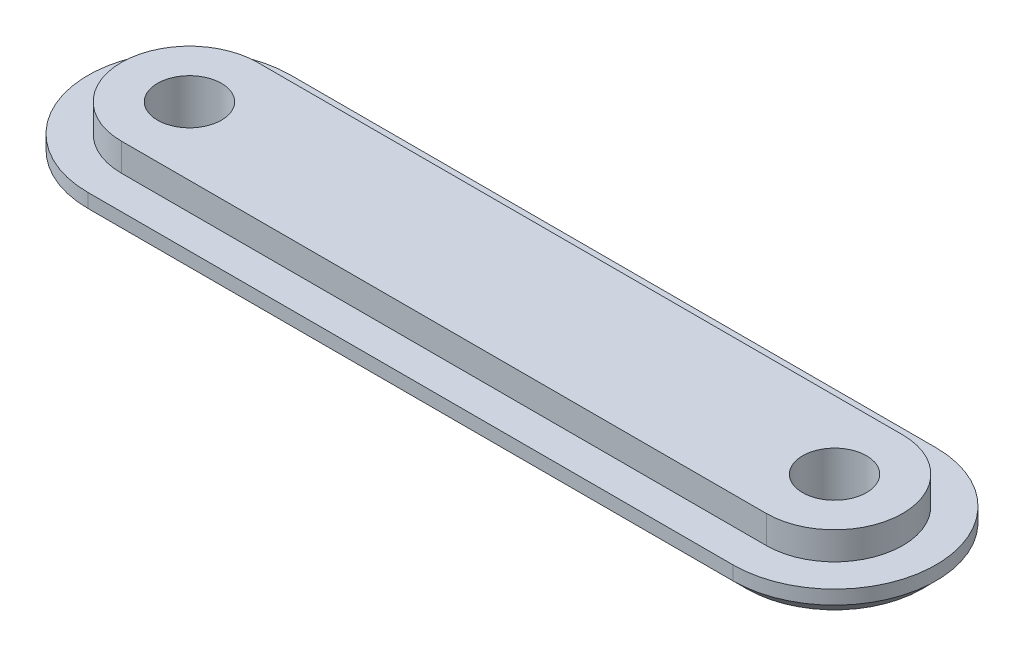
ISO-10303-21;
HEADER;
FILE_DESCRIPTION(('STEP AP214'),'2;1');
FILE_NAME('part.step','',(''),(''),'','','');
FILE_SCHEMA(('AUTOMOTIVE_DESIGN { 1 0 10303 214 1 1 1 1 }'));
ENDSEC;
DATA;
#1=APPLICATION_CONTEXT('core data for automotive mechanical design processes');
#2=APPLICATION_PROTOCOL_DEFINITION('international standard','automotive_design',2000,#1);
#3=PRODUCT_CONTEXT('',#1,'mechanical');
#4=PRODUCT('Part','Part','',(#3));
#5=PRODUCT_RELATED_PRODUCT_CATEGORY('part','',(#4));
#6=PRODUCT_DEFINITION_FORMATION('','',#4);
#7=PRODUCT_DEFINITION_CONTEXT('part definition',#1,'design');
#8=PRODUCT_DEFINITION('design','',#6,#7);
#9=PRODUCT_DEFINITION_SHAPE('','',#8);
#10=(LENGTH_UNIT() NAMED_UNIT(*) SI_UNIT(.MILLI.,.METRE.));
#11=(NAMED_UNIT(*) PLANE_ANGLE_UNIT() SI_UNIT($,.RADIAN.));
#12=(NAMED_UNIT(*) SI_UNIT($,.STERADIAN.) SOLID_ANGLE_UNIT());
#13=UNCERTAINTY_MEASURE_WITH_UNIT(LENGTH_MEASURE(1.E-05),#10,'distance_accuracy_value','');
#14=(GEOMETRIC_REPRESENTATION_CONTEXT(3) GLOBAL_UNCERTAINTY_ASSIGNED_CONTEXT((#13)) GLOBAL_UNIT_ASSIGNED_CONTEXT((#10,
#11,#12)) REPRESENTATION_CONTEXT('',''));
#15=CARTESIAN_POINT('',(0.,0.,0.));
#16=DIRECTION('',(0.,0.,1.));
#17=DIRECTION('',(1.,0.,0.));
#18=AXIS2_PLACEMENT_3D('',#15,#16,#17);
#19=CARTESIAN_POINT('',(-11.6,-1.,0.));
#20=DIRECTION('',(0.,1.,0.));
#21=DIRECTION('',(0.,0.,1.));
#22=AXIS2_PLACEMENT_3D('',#19,#20,#21);
#23=CYLINDRICAL_SURFACE('',#22,3.65);
#24=DIRECTION('',(0.,1.,0.));
#25=VECTOR('',#24,1.);
#26=CARTESIAN_POINT('',(-11.6,-1.,-3.65));
#27=LINE('',#26,#25);
#28=CARTESIAN_POINT('',(-11.6,-0.5,-3.65));
#29=VERTEX_POINT('',#28);
#30=CARTESIAN_POINT('',(-11.6,0.,-3.65));
#31=VERTEX_POINT('',#30);
#32=EDGE_CURVE('E153',#29,#31,#27,.T.);
#33=ORIENTED_EDGE('',*,*,#32,.F.);
#34=CARTESIAN_POINT('',(-11.6,-0.5,0.));
#35=DIRECTION('',(0.,1.,0.));
#36=DIRECTION('',(0.,0.,1.));
#37=AXIS2_PLACEMENT_3D('',#34,#35,#36);
#38=CIRCLE('',#37,3.65);
#39=CARTESIAN_POINT('',(-11.6,-0.5,3.65));
#40=VERTEX_POINT('',#39);
#41=EDGE_CURVE('E55',#29,#40,#38,.T.);
#42=ORIENTED_EDGE('',*,*,#41,.T.);
#43=DIRECTION('',(0.,1.,0.));
#44=VECTOR('',#43,1.);
#45=CARTESIAN_POINT('',(-11.6,-1.,3.65));
#46=LINE('',#45,#44);
#47=CARTESIAN_POINT('',(-11.6,0.,3.65));
#48=VERTEX_POINT('',#47);
#49=EDGE_CURVE('E152',#40,#48,#46,.T.);
#50=ORIENTED_EDGE('',*,*,#49,.T.);
#51=CARTESIAN_POINT('',(-11.6,0.,0.));
#52=DIRECTION('',(0.,1.,0.));
#53=DIRECTION('',(0.,0.,1.));
#54=AXIS2_PLACEMENT_3D('',#51,#52,#53);
#55=CIRCLE('',#54,3.65);
#56=EDGE_CURVE('E135',#31,#48,#55,.T.);
#57=ORIENTED_EDGE('',*,*,#56,.F.);
#58=EDGE_LOOP('',(#33,#42,#50,#57));
#59=FACE_BOUND('',#58,.T.);
#60=ADVANCED_FACE('F32',(#59),#23,.T.);
#61=CARTESIAN_POINT('',(11.6,-1.,-3.65));
#62=DIRECTION('',(0.,0.,-1.));
#63=DIRECTION('',(-1.,0.,0.));
#64=AXIS2_PLACEMENT_3D('',#61,#62,#63);
#65=PLANE('',#64);
#66=DIRECTION('',(0.,1.,0.));
#67=VECTOR('',#66,1.);
#68=CARTESIAN_POINT('',(11.6,-1.,-3.65));
#69=LINE('',#68,#67);
#70=CARTESIAN_POINT('',(11.6,-0.5,-3.65));
#71=VERTEX_POINT('',#70);
#72=CARTESIAN_POINT('',(11.6,0.,-3.65));
#73=VERTEX_POINT('',#72);
#74=EDGE_CURVE('E156',#71,#73,#69,.T.);
#75=ORIENTED_EDGE('',*,*,#74,.F.);
#76=DIRECTION('',(-1.,0.,0.));
#77=VECTOR('',#76,1.);
#78=CARTESIAN_POINT('',(-11.6,-0.5,-3.65));
#79=LINE('',#78,#77);
#80=EDGE_CURVE('E155',#71,#29,#79,.T.);
#81=ORIENTED_EDGE('',*,*,#80,.T.);
#82=ORIENTED_EDGE('',*,*,#32,.T.);
#83=DIRECTION('',(-1.,0.,0.));
#84=VECTOR('',#83,1.);
#85=CARTESIAN_POINT('',(11.6,0.,-3.65));
#86=LINE('',#85,#84);
#87=EDGE_CURVE('E149',#73,#31,#86,.T.);
#88=ORIENTED_EDGE('',*,*,#87,.F.);
#89=EDGE_LOOP('',(#75,#81,#82,#88));
#90=FACE_BOUND('',#89,.T.);
#91=ADVANCED_FACE('F231',(#90),#65,.T.);
#92=CARTESIAN_POINT('',(11.6,-1.,0.));
#93=DIRECTION('',(0.,1.,0.));
#94=DIRECTION('',(0.,0.,1.));
#95=AXIS2_PLACEMENT_3D('',#92,#93,#94);
#96=CYLINDRICAL_SURFACE('',#95,3.65);
#97=DIRECTION('',(0.,1.,0.));
#98=VECTOR('',#97,1.);
#99=CARTESIAN_POINT('',(11.6,-1.,3.65));
#100=LINE('',#99,#98);
#101=CARTESIAN_POINT('',(11.6,-0.5,3.65));
#102=VERTEX_POINT('',#101);
#103=CARTESIAN_POINT('',(11.6,0.,3.65));
#104=VERTEX_POINT('',#103);
#105=EDGE_CURVE('E158',#102,#104,#100,.T.);
#106=ORIENTED_EDGE('',*,*,#105,.F.);
#107=CARTESIAN_POINT('',(11.6,-0.5,0.));
#108=DIRECTION('',(0.,1.,0.));
#109=DIRECTION('',(0.,0.,1.));
#110=AXIS2_PLACEMENT_3D('',#107,#108,#109);
#111=CIRCLE('',#110,3.65);
#112=EDGE_CURVE('E41',#102,#71,#111,.T.);
#113=ORIENTED_EDGE('',*,*,#112,.T.);
#114=ORIENTED_EDGE('',*,*,#74,.T.);
#115=CARTESIAN_POINT('',(11.6,0.,0.));
#116=DIRECTION('',(0.,1.,0.));
#117=DIRECTION('',(0.,0.,1.));
#118=AXIS2_PLACEMENT_3D('',#115,#116,#117);
#119=CIRCLE('',#118,3.65);
#120=EDGE_CURVE('E146',#104,#73,#119,.T.);
#121=ORIENTED_EDGE('',*,*,#120,.F.);
#122=EDGE_LOOP('',(#106,#113,#114,#121));
#123=FACE_BOUND('',#122,.T.);
#124=ADVANCED_FACE('F228',(#123),#96,.T.);
#125=CARTESIAN_POINT('',(-11.6,-1.,3.65));
#126=DIRECTION('',(0.,0.,1.));
#127=DIRECTION('',(1.,0.,0.));
#128=AXIS2_PLACEMENT_3D('',#125,#126,#127);
#129=PLANE('',#128);
#130=ORIENTED_EDGE('',*,*,#49,.F.);
#131=DIRECTION('',(1.,0.,0.));
#132=VECTOR('',#131,1.);
#133=CARTESIAN_POINT('',(11.6,-0.5,3.65));
#134=LINE('',#133,#132);
#135=EDGE_CURVE('E11',#40,#102,#134,.T.);
#136=ORIENTED_EDGE('',*,*,#135,.T.);
#137=ORIENTED_EDGE('',*,*,#105,.T.);
#138=DIRECTION('',(1.,0.,0.));
#139=VECTOR('',#138,1.);
#140=CARTESIAN_POINT('',(-11.6,0.,3.65));
#141=LINE('',#140,#139);
#142=EDGE_CURVE('E138',#48,#104,#141,.T.);
#143=ORIENTED_EDGE('',*,*,#142,.F.);
#144=EDGE_LOOP('',(#130,#136,#137,#143));
#145=FACE_BOUND('',#144,.T.);
#146=ADVANCED_FACE('F225',(#145),#129,.T.);
#147=CARTESIAN_POINT('',(-11.6,-1.,0.));
#148=DIRECTION('',(0.,1.,0.));
#149=DIRECTION('',(0.,0.,1.));
#150=AXIS2_PLACEMENT_3D('',#147,#148,#149);
#151=PLANE('',#150);
#152=CARTESIAN_POINT('',(-11.6,-1.,0.));
#153=DIRECTION('',(0.,1.,0.));
#154=DIRECTION('',(0.,0.,1.));
#155=AXIS2_PLACEMENT_3D('',#152,#153,#154);
#156=CIRCLE('',#155,3.15);
#157=CARTESIAN_POINT('',(-11.6,-1.,3.15));
#158=VERTEX_POINT('',#157);
#159=CARTESIAN_POINT('',(-11.6,-1.,-3.15));
#160=VERTEX_POINT('',#159);
#161=EDGE_CURVE('E167',#158,#160,#156,.F.);
#162=ORIENTED_EDGE('',*,*,#161,.T.);
#163=DIRECTION('',(1.,0.,0.));
#164=VECTOR('',#163,1.);
#165=CARTESIAN_POINT('',(11.6,-1.,-3.15));
#166=LINE('',#165,#164);
#167=CARTESIAN_POINT('',(11.6,-1.,-3.15));
#168=VERTEX_POINT('',#167);
#169=EDGE_CURVE('E169',#160,#168,#166,.T.);
#170=ORIENTED_EDGE('',*,*,#169,.T.);
#171=CARTESIAN_POINT('',(11.6,-1.,0.));
#172=DIRECTION('',(0.,1.,0.));
#173=DIRECTION('',(0.,0.,1.));
#174=AXIS2_PLACEMENT_3D('',#171,#172,#173);
#175=CIRCLE('',#174,3.15);
#176=CARTESIAN_POINT('',(11.6,-1.,3.15));
#177=VERTEX_POINT('',#176);
#178=EDGE_CURVE('E165',#168,#177,#175,.F.);
#179=ORIENTED_EDGE('',*,*,#178,.T.);
#180=DIRECTION('',(-1.,0.,0.));
#181=VECTOR('',#180,1.);
#182=CARTESIAN_POINT('',(-11.6,-1.,3.15));
#183=LINE('',#182,#181);
#184=EDGE_CURVE('E163',#177,#158,#183,.T.);
#185=ORIENTED_EDGE('',*,*,#184,.T.);
#186=EDGE_LOOP('',(#162,#170,#179,#185));
#187=FACE_BOUND('',#186,.T.);
#188=CARTESIAN_POINT('',(-11.6,-1.,0.));
#189=DIRECTION('',(0.,1.,0.));
#190=DIRECTION('',(0.,0.,1.));
#191=AXIS2_PLACEMENT_3D('',#188,#189,#190);
#192=CIRCLE('',#191,1.15);
#193=CARTESIAN_POINT('',(-11.6,-1.,1.15));
#194=VERTEX_POINT('',#193);
#195=EDGE_CURVE('E203',#194,#194,#192,.T.);
#196=ORIENTED_EDGE('',*,*,#195,.T.);
#197=EDGE_LOOP('',(#196));
#198=FACE_BOUND('',#197,.T.);
#199=CARTESIAN_POINT('',(11.6,-1.,0.));
#200=DIRECTION('',(0.,1.,0.));
#201=DIRECTION('',(0.,0.,1.));
#202=AXIS2_PLACEMENT_3D('',#199,#200,#201);
#203=CIRCLE('',#202,1.15);
#204=CARTESIAN_POINT('',(11.6,-1.,1.15));
#205=VERTEX_POINT('',#204);
#206=EDGE_CURVE('E189',#205,#205,#203,.T.);
#207=ORIENTED_EDGE('',*,*,#206,.T.);
#208=EDGE_LOOP('',(#207));
#209=FACE_BOUND('',#208,.T.);
#210=ADVANCED_FACE('F220',(#187,#198,#209),#151,.F.);
#211=CARTESIAN_POINT('',(-11.6,0.,0.));
#212=DIRECTION('',(0.,1.,0.));
#213=DIRECTION('',(0.,0.,1.));
#214=AXIS2_PLACEMENT_3D('',#211,#212,#213);
#215=PLANE('',#214);
#216=CARTESIAN_POINT('',(11.6,0.,0.));
#217=DIRECTION('',(0.,1.,0.));
#218=DIRECTION('',(0.,0.,1.));
#219=AXIS2_PLACEMENT_3D('',#216,#217,#218);
#220=CIRCLE('',#219,2.45);
#221=CARTESIAN_POINT('',(11.6,0.,2.45));
#222=VERTEX_POINT('',#221);
#223=CARTESIAN_POINT('',(11.6,0.,-2.45));
#224=VERTEX_POINT('',#223);
#225=EDGE_CURVE('E134',#222,#224,#220,.T.);
#226=ORIENTED_EDGE('',*,*,#225,.F.);
#227=DIRECTION('',(1.,0.,0.));
#228=VECTOR('',#227,1.);
#229=CARTESIAN_POINT('',(-11.6,0.,2.45));
#230=LINE('',#229,#228);
#231=CARTESIAN_POINT('',(-11.6,0.,2.45));
#232=VERTEX_POINT('',#231);
#233=EDGE_CURVE('E131',#232,#222,#230,.T.);
#234=ORIENTED_EDGE('',*,*,#233,.F.);
#235=CARTESIAN_POINT('',(-11.6,0.,0.));
#236=DIRECTION('',(0.,1.,0.));
#237=DIRECTION('',(0.,0.,1.));
#238=AXIS2_PLACEMENT_3D('',#235,#236,#237);
#239=CIRCLE('',#238,2.45);
#240=CARTESIAN_POINT('',(-11.6,0.,-2.45));
#241=VERTEX_POINT('',#240);
#242=EDGE_CURVE('E205',#241,#232,#239,.T.);
#243=ORIENTED_EDGE('',*,*,#242,.F.);
#244=DIRECTION('',(-1.,0.,0.));
#245=VECTOR('',#244,1.);
#246=CARTESIAN_POINT('',(11.6,0.,-2.45));
#247=LINE('',#246,#245);
#248=EDGE_CURVE('E202',#224,#241,#247,.T.);
#249=ORIENTED_EDGE('',*,*,#248,.F.);
#250=EDGE_LOOP('',(#226,#234,#243,#249));
#251=FACE_BOUND('',#250,.T.);
#252=ORIENTED_EDGE('',*,*,#56,.T.);
#253=ORIENTED_EDGE('',*,*,#142,.T.);
#254=ORIENTED_EDGE('',*,*,#120,.T.);
#255=ORIENTED_EDGE('',*,*,#87,.T.);
#256=EDGE_LOOP('',(#252,#253,#254,#255));
#257=FACE_BOUND('',#256,.T.);
#258=ADVANCED_FACE('F217',(#251,#257),#215,.T.);
#259=CARTESIAN_POINT('',(11.6,1.,0.));
#260=DIRECTION('',(0.,-1.,0.));
#261=DIRECTION('',(0.,0.,-1.));
#262=AXIS2_PLACEMENT_3D('',#259,#260,#261);
#263=CYLINDRICAL_SURFACE('',#262,2.45);
#264=ORIENTED_EDGE('',*,*,#225,.T.);
#265=DIRECTION('',(0.,-1.,0.));
#266=VECTOR('',#265,1.);
#267=CARTESIAN_POINT('',(11.6,1.,-2.45));
#268=LINE('',#267,#266);
#269=CARTESIAN_POINT('',(11.6,1.,-2.45));
#270=VERTEX_POINT('',#269);
#271=EDGE_CURVE('E115',#270,#224,#268,.T.);
#272=ORIENTED_EDGE('',*,*,#271,.F.);
#273=CARTESIAN_POINT('',(11.6,1.,0.));
#274=DIRECTION('',(0.,1.,0.));
#275=DIRECTION('',(0.,0.,1.));
#276=AXIS2_PLACEMENT_3D('',#273,#274,#275);
#277=CIRCLE('',#276,2.45);
#278=CARTESIAN_POINT('',(11.6,1.,2.45));
#279=VERTEX_POINT('',#278);
#280=EDGE_CURVE('E122',#279,#270,#277,.T.);
#281=ORIENTED_EDGE('',*,*,#280,.F.);
#282=DIRECTION('',(0.,-1.,0.));
#283=VECTOR('',#282,1.);
#284=CARTESIAN_POINT('',(11.6,1.,2.45));
#285=LINE('',#284,#283);
#286=EDGE_CURVE('E200',#279,#222,#285,.T.);
#287=ORIENTED_EDGE('',*,*,#286,.T.);
#288=EDGE_LOOP('',(#264,#272,#281,#287));
#289=FACE_BOUND('',#288,.T.);
#290=ADVANCED_FACE('F133',(#289),#263,.T.);
#291=CARTESIAN_POINT('',(11.6,1.,-2.45));
#292=DIRECTION('',(0.,0.,1.));
#293=DIRECTION('',(1.,0.,0.));
#294=AXIS2_PLACEMENT_3D('',#291,#292,#293);
#295=PLANE('',#294);
#296=ORIENTED_EDGE('',*,*,#248,.T.);
#297=DIRECTION('',(0.,-1.,0.));
#298=VECTOR('',#297,1.);
#299=CARTESIAN_POINT('',(-11.6,1.,-2.45));
#300=LINE('',#299,#298);
#301=CARTESIAN_POINT('',(-11.6,1.,-2.45));
#302=VERTEX_POINT('',#301);
#303=EDGE_CURVE('E118',#302,#241,#300,.T.);
#304=ORIENTED_EDGE('',*,*,#303,.F.);
#305=DIRECTION('',(-1.,0.,0.));
#306=VECTOR('',#305,1.);
#307=CARTESIAN_POINT('',(11.6,1.,-2.45));
#308=LINE('',#307,#306);
#309=EDGE_CURVE('E110',#270,#302,#308,.T.);
#310=ORIENTED_EDGE('',*,*,#309,.F.);
#311=ORIENTED_EDGE('',*,*,#271,.T.);
#312=EDGE_LOOP('',(#296,#304,#310,#311));
#313=FACE_BOUND('',#312,.T.);
#314=ADVANCED_FACE('F113',(#313),#295,.F.);
#315=CARTESIAN_POINT('',(-11.6,1.,0.));
#316=DIRECTION('',(0.,-1.,0.));
#317=DIRECTION('',(0.,0.,-1.));
#318=AXIS2_PLACEMENT_3D('',#315,#316,#317);
#319=CYLINDRICAL_SURFACE('',#318,2.45);
#320=ORIENTED_EDGE('',*,*,#242,.T.);
#321=DIRECTION('',(0.,-1.,0.));
#322=VECTOR('',#321,1.);
#323=CARTESIAN_POINT('',(-11.6,1.,2.45));
#324=LINE('',#323,#322);
#325=CARTESIAN_POINT('',(-11.6,1.,2.45));
#326=VERTEX_POINT('',#325);
#327=EDGE_CURVE('E140',#326,#232,#324,.T.);
#328=ORIENTED_EDGE('',*,*,#327,.F.);
#329=CARTESIAN_POINT('',(-11.6,1.,0.));
#330=DIRECTION('',(0.,1.,0.));
#331=DIRECTION('',(0.,0.,1.));
#332=AXIS2_PLACEMENT_3D('',#329,#330,#331);
#333=CIRCLE('',#332,2.45);
#334=EDGE_CURVE('E121',#302,#326,#333,.T.);
#335=ORIENTED_EDGE('',*,*,#334,.F.);
#336=ORIENTED_EDGE('',*,*,#303,.T.);
#337=EDGE_LOOP('',(#320,#328,#335,#336));
#338=FACE_BOUND('',#337,.T.);
#339=ADVANCED_FACE('F215',(#338),#319,.T.);
#340=CARTESIAN_POINT('',(-11.6,1.,2.45));
#341=DIRECTION('',(0.,0.,-1.));
#342=DIRECTION('',(-1.,0.,0.));
#343=AXIS2_PLACEMENT_3D('',#340,#341,#342);
#344=PLANE('',#343);
#345=ORIENTED_EDGE('',*,*,#233,.T.);
#346=ORIENTED_EDGE('',*,*,#286,.F.);
#347=DIRECTION('',(1.,0.,0.));
#348=VECTOR('',#347,1.);
#349=CARTESIAN_POINT('',(-11.6,1.,2.45));
#350=LINE('',#349,#348);
#351=EDGE_CURVE('E127',#326,#279,#350,.T.);
#352=ORIENTED_EDGE('',*,*,#351,.F.);
#353=ORIENTED_EDGE('',*,*,#327,.T.);
#354=EDGE_LOOP('',(#345,#346,#352,#353));
#355=FACE_BOUND('',#354,.T.);
#356=ADVANCED_FACE('F213',(#355),#344,.F.);
#357=CARTESIAN_POINT('',(11.6,1.,0.));
#358=DIRECTION('',(0.,1.,0.));
#359=DIRECTION('',(0.,0.,1.));
#360=AXIS2_PLACEMENT_3D('',#357,#358,#359);
#361=PLANE('',#360);
#362=CARTESIAN_POINT('',(-11.6,1.,0.));
#363=DIRECTION('',(0.,1.,0.));
#364=DIRECTION('',(0.,0.,1.));
#365=AXIS2_PLACEMENT_3D('',#362,#363,#364);
#366=CIRCLE('',#365,1.15);
#367=CARTESIAN_POINT('',(-11.6,1.,1.15));
#368=VERTEX_POINT('',#367);
#369=EDGE_CURVE('E194',#368,#368,#366,.T.);
#370=ORIENTED_EDGE('',*,*,#369,.F.);
#371=EDGE_LOOP('',(#370));
#372=FACE_BOUND('',#371,.T.);
#373=CARTESIAN_POINT('',(11.6,1.,0.));
#374=DIRECTION('',(0.,1.,0.));
#375=DIRECTION('',(0.,0.,1.));
#376=AXIS2_PLACEMENT_3D('',#373,#374,#375);
#377=CIRCLE('',#376,1.15);
#378=CARTESIAN_POINT('',(11.6,1.,1.15));
#379=VERTEX_POINT('',#378);
#380=EDGE_CURVE('E183',#379,#379,#377,.T.);
#381=ORIENTED_EDGE('',*,*,#380,.F.);
#382=EDGE_LOOP('',(#381));
#383=FACE_BOUND('',#382,.T.);
#384=ORIENTED_EDGE('',*,*,#280,.T.);
#385=ORIENTED_EDGE('',*,*,#309,.T.);
#386=ORIENTED_EDGE('',*,*,#334,.T.);
#387=ORIENTED_EDGE('',*,*,#351,.T.);
#388=EDGE_LOOP('',(#384,#385,#386,#387));
#389=FACE_BOUND('',#388,.T.);
#390=ADVANCED_FACE('F125',(#372,#383,#389),#361,.T.);
#391=CARTESIAN_POINT('',(11.6,-1.,0.));
#392=DIRECTION('',(0.,1.,0.));
#393=DIRECTION('',(0.,0.,1.));
#394=AXIS2_PLACEMENT_3D('',#391,#392,#393);
#395=CYLINDRICAL_SURFACE('',#394,1.15);
#396=ORIENTED_EDGE('',*,*,#206,.F.);
#397=EDGE_LOOP('',(#396));
#398=FACE_BOUND('',#397,.T.);
#399=ORIENTED_EDGE('',*,*,#380,.T.);
#400=EDGE_LOOP('',(#399));
#401=FACE_BOUND('',#400,.T.);
#402=ADVANCED_FACE('F271',(#398,#401),#395,.F.);
#403=CARTESIAN_POINT('',(-11.6,-1.,0.));
#404=DIRECTION('',(0.,1.,0.));
#405=DIRECTION('',(0.,0.,1.));
#406=AXIS2_PLACEMENT_3D('',#403,#404,#405);
#407=CYLINDRICAL_SURFACE('',#406,1.15);
#408=ORIENTED_EDGE('',*,*,#195,.F.);
#409=EDGE_LOOP('',(#408));
#410=FACE_BOUND('',#409,.T.);
#411=ORIENTED_EDGE('',*,*,#369,.T.);
#412=EDGE_LOOP('',(#411));
#413=FACE_BOUND('',#412,.T.);
#414=ADVANCED_FACE('F275',(#410,#413),#407,.F.);
#415=CARTESIAN_POINT('',(-11.6,-0.5,3.65));
#416=DIRECTION('',(0.,-0.70710678118655,0.707106781186545));
#417=DIRECTION('',(-1.,0.,0.));
#418=AXIS2_PLACEMENT_3D('',#415,#416,#417);
#419=PLANE('',#418);
#420=DIRECTION('',(0.,0.707106781186545,0.70710678118655));
#421=VECTOR('',#420,1.);
#422=CARTESIAN_POINT('',(-11.6,-1.,3.15));
#423=LINE('',#422,#421);
#424=EDGE_CURVE('E177',#158,#40,#423,.T.);
#425=ORIENTED_EDGE('',*,*,#424,.F.);
#426=ORIENTED_EDGE('',*,*,#184,.F.);
#427=DIRECTION('',(0.,-0.707106781186545,-0.70710678118655));
#428=VECTOR('',#427,1.);
#429=CARTESIAN_POINT('',(11.6,-0.5,3.65));
#430=LINE('',#429,#428);
#431=EDGE_CURVE('E36',#102,#177,#430,.T.);
#432=ORIENTED_EDGE('',*,*,#431,.F.);
#433=ORIENTED_EDGE('',*,*,#135,.F.);
#434=EDGE_LOOP('',(#425,#426,#432,#433));
#435=FACE_BOUND('',#434,.T.);
#436=ADVANCED_FACE('F34',(#435),#419,.T.);
#437=CARTESIAN_POINT('',(11.6,-0.5,0.));
#438=DIRECTION('',(0.,1.,0.));
#439=DIRECTION('',(0.,0.,1.));
#440=AXIS2_PLACEMENT_3D('',#437,#438,#439);
#441=CONICAL_SURFACE('',#440,3.65,0.785398163397452);
#442=ORIENTED_EDGE('',*,*,#431,.T.);
#443=ORIENTED_EDGE('',*,*,#178,.F.);
#444=DIRECTION('',(0.,-0.707106781186545,0.70710678118655));
#445=VECTOR('',#444,1.);
#446=CARTESIAN_POINT('',(11.6,-0.5,-3.65));
#447=LINE('',#446,#445);
#448=EDGE_CURVE('E176',#71,#168,#447,.T.);
#449=ORIENTED_EDGE('',*,*,#448,.F.);
#450=ORIENTED_EDGE('',*,*,#112,.F.);
#451=EDGE_LOOP('',(#442,#443,#449,#450));
#452=FACE_BOUND('',#451,.T.);
#453=ADVANCED_FACE('F240',(#452),#441,.T.);
#454=CARTESIAN_POINT('',(-11.6,-0.5,0.));
#455=DIRECTION('',(0.,1.,0.));
#456=DIRECTION('',(0.,0.,1.));
#457=AXIS2_PLACEMENT_3D('',#454,#455,#456);
#458=CONICAL_SURFACE('',#457,3.65,0.785398163397452);
#459=ORIENTED_EDGE('',*,*,#424,.T.);
#460=ORIENTED_EDGE('',*,*,#41,.F.);
#461=DIRECTION('',(0.,0.707106781186545,-0.70710678118655));
#462=VECTOR('',#461,1.);
#463=CARTESIAN_POINT('',(-11.6,-1.,-3.15));
#464=LINE('',#463,#462);
#465=EDGE_CURVE('E174',#160,#29,#464,.T.);
#466=ORIENTED_EDGE('',*,*,#465,.F.);
#467=ORIENTED_EDGE('',*,*,#161,.F.);
#468=EDGE_LOOP('',(#459,#460,#466,#467));
#469=FACE_BOUND('',#468,.T.);
#470=ADVANCED_FACE('F238',(#469),#458,.T.);
#471=CARTESIAN_POINT('',(11.6,-0.5,-3.65));
#472=DIRECTION('',(0.,-0.70710678118655,-0.707106781186545));
#473=DIRECTION('',(1.,0.,0.));
#474=AXIS2_PLACEMENT_3D('',#471,#472,#473);
#475=PLANE('',#474);
#476=ORIENTED_EDGE('',*,*,#448,.T.);
#477=ORIENTED_EDGE('',*,*,#169,.F.);
#478=ORIENTED_EDGE('',*,*,#465,.T.);
#479=ORIENTED_EDGE('',*,*,#80,.F.);
#480=EDGE_LOOP('',(#476,#477,#478,#479));
#481=FACE_BOUND('',#480,.T.);
#482=ADVANCED_FACE('F235',(#481),#475,.T.);
#483=CLOSED_SHELL('',(#60,#91,#124,#146,#210,#258,#290,#314,#339,#356,#390,#402,#414,#436,#453,
#470,#482));
#484=MANIFOLD_SOLID_BREP('B2',#483);
#485=ADVANCED_BREP_SHAPE_REPRESENTATION('',(#18,#484),#14);
#486=SHAPE_DEFINITION_REPRESENTATION(#9,#485);
ENDSEC;
END-ISO-10303-21;
